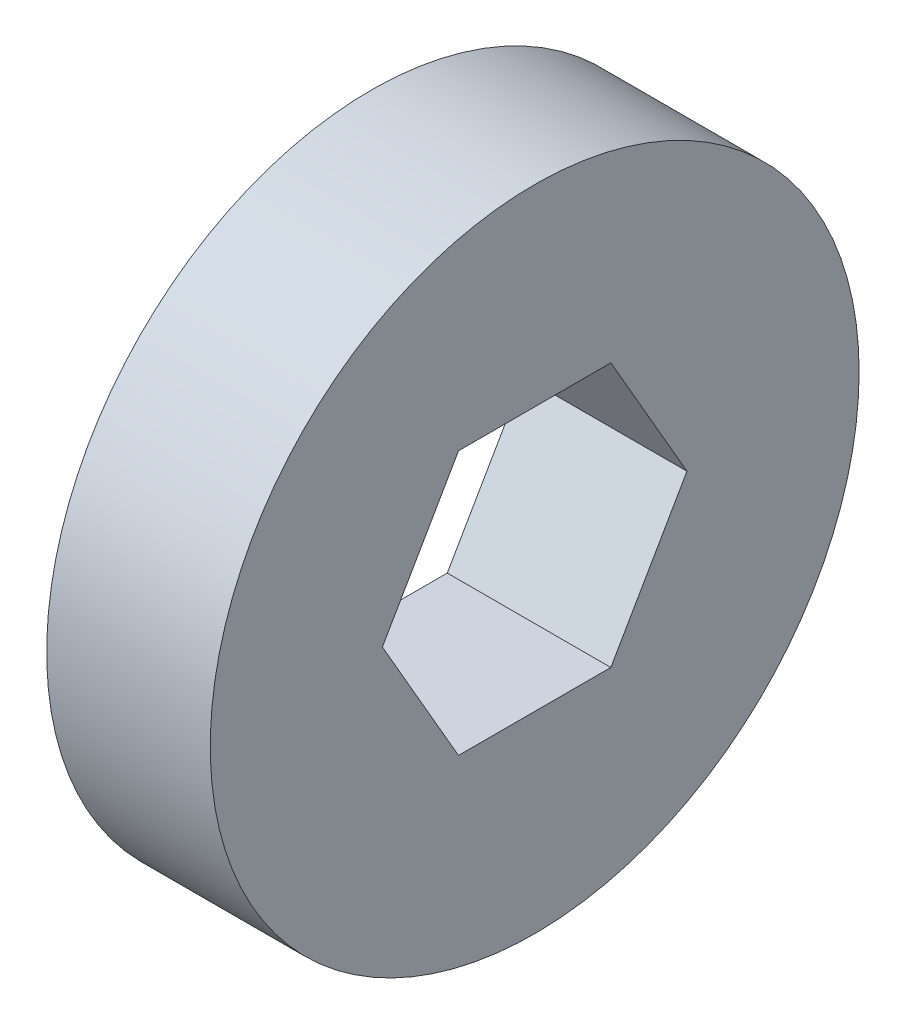
ISO-10303-21;
HEADER;
FILE_DESCRIPTION(('STEP AP214'),'2;1');
FILE_NAME('part.step','',(''),(''),'','','');
FILE_SCHEMA(('AUTOMOTIVE_DESIGN { 1 0 10303 214 1 1 1 1 }'));
ENDSEC;
DATA;
#1=APPLICATION_CONTEXT('core data for automotive mechanical design processes');
#2=APPLICATION_PROTOCOL_DEFINITION('international standard','automotive_design',2000,#1);
#3=PRODUCT_CONTEXT('',#1,'mechanical');
#4=PRODUCT('Part','Part','',(#3));
#5=PRODUCT_RELATED_PRODUCT_CATEGORY('part','',(#4));
#6=PRODUCT_DEFINITION_FORMATION('','',#4);
#7=PRODUCT_DEFINITION_CONTEXT('part definition',#1,'design');
#8=PRODUCT_DEFINITION('design','',#6,#7);
#9=PRODUCT_DEFINITION_SHAPE('','',#8);
#10=(LENGTH_UNIT() NAMED_UNIT(*) SI_UNIT(.MILLI.,.METRE.));
#11=(NAMED_UNIT(*) PLANE_ANGLE_UNIT() SI_UNIT($,.RADIAN.));
#12=(NAMED_UNIT(*) SI_UNIT($,.STERADIAN.) SOLID_ANGLE_UNIT());
#13=UNCERTAINTY_MEASURE_WITH_UNIT(LENGTH_MEASURE(1.E-05),#10,'distance_accuracy_value','');
#14=(GEOMETRIC_REPRESENTATION_CONTEXT(3) GLOBAL_UNCERTAINTY_ASSIGNED_CONTEXT((#13)) GLOBAL_UNIT_ASSIGNED_CONTEXT((#10,
#11,#12)) REPRESENTATION_CONTEXT('',''));
#15=CARTESIAN_POINT('',(0.,0.,0.));
#16=DIRECTION('',(0.,0.,1.));
#17=DIRECTION('',(1.,0.,0.));
#18=AXIS2_PLACEMENT_3D('',#15,#16,#17);
#19=CARTESIAN_POINT('',(7.874,0.,0.));
#20=DIRECTION('',(1.,0.,0.));
#21=DIRECTION('',(0.,0.,-1.));
#22=AXIS2_PLACEMENT_3D('',#19,#20,#21);
#23=PLANE('',#22);
#24=CARTESIAN_POINT('',(7.874,0.,0.));
#25=DIRECTION('',(1.,0.,0.));
#26=DIRECTION('',(0.,0.,-1.));
#27=AXIS2_PLACEMENT_3D('',#24,#25,#26);
#28=CIRCLE('',#27,15.621);
#29=CARTESIAN_POINT('',(7.874,0.,-15.621));
#30=VERTEX_POINT('',#29);
#31=EDGE_CURVE('E11',#30,#30,#28,.T.);
#32=ORIENTED_EDGE('',*,*,#31,.T.);
#33=EDGE_LOOP('',(#32));
#34=FACE_BOUND('',#33,.T.);
#35=DIRECTION('',(0.,0.,1.));
#36=VECTOR('',#35,1.);
#37=CARTESIAN_POINT('',(7.874,6.35,-3.66617420935412));
#38=LINE('',#37,#36);
#39=CARTESIAN_POINT('',(7.874,6.35,-3.66617420935412));
#40=VERTEX_POINT('',#39);
#41=CARTESIAN_POINT('',(7.874,6.35,3.66617420935412));
#42=VERTEX_POINT('',#41);
#43=EDGE_CURVE('E94',#40,#42,#38,.T.);
#44=ORIENTED_EDGE('',*,*,#43,.F.);
#45=DIRECTION('',(0.,0.866025403784439,0.5));
#46=VECTOR('',#45,1.);
#47=CARTESIAN_POINT('',(7.874,0.,-7.33234841870825));
#48=LINE('',#47,#46);
#49=CARTESIAN_POINT('',(7.874,0.,-7.33234841870825));
#50=VERTEX_POINT('',#49);
#51=EDGE_CURVE('E86',#50,#40,#48,.T.);
#52=ORIENTED_EDGE('',*,*,#51,.F.);
#53=DIRECTION('',(0.,0.866025403784439,-0.5));
#54=VECTOR('',#53,1.);
#55=CARTESIAN_POINT('',(7.874,-6.35,-3.66617420935412));
#56=LINE('',#55,#54);
#57=CARTESIAN_POINT('',(7.874,-6.35,-3.66617420935412));
#58=VERTEX_POINT('',#57);
#59=EDGE_CURVE('E114',#58,#50,#56,.T.);
#60=ORIENTED_EDGE('',*,*,#59,.F.);
#61=DIRECTION('',(0.,0.,-1.));
#62=VECTOR('',#61,1.);
#63=CARTESIAN_POINT('',(7.874,-6.35,3.66617420935412));
#64=LINE('',#63,#62);
#65=CARTESIAN_POINT('',(7.874,-6.35,3.66617420935412));
#66=VERTEX_POINT('',#65);
#67=EDGE_CURVE('E112',#66,#58,#64,.T.);
#68=ORIENTED_EDGE('',*,*,#67,.F.);
#69=DIRECTION('',(0.,-0.866025403784438,-0.5));
#70=VECTOR('',#69,1.);
#71=CARTESIAN_POINT('',(7.874,0.,7.33234841870825));
#72=LINE('',#71,#70);
#73=CARTESIAN_POINT('',(7.874,0.,7.33234841870825));
#74=VERTEX_POINT('',#73);
#75=EDGE_CURVE('E108',#74,#66,#72,.T.);
#76=ORIENTED_EDGE('',*,*,#75,.F.);
#77=DIRECTION('',(0.,-0.866025403784439,0.5));
#78=VECTOR('',#77,1.);
#79=CARTESIAN_POINT('',(7.874,6.35,3.66617420935412));
#80=LINE('',#79,#78);
#81=EDGE_CURVE('E106',#42,#74,#80,.T.);
#82=ORIENTED_EDGE('',*,*,#81,.F.);
#83=EDGE_LOOP('',(#44,#52,#60,#68,#76,#82));
#84=FACE_BOUND('',#83,.T.);
#85=ADVANCED_FACE('F33',(#34,#84),#23,.T.);
#86=CARTESIAN_POINT('',(0.,0.,0.));
#87=DIRECTION('',(1.,0.,0.));
#88=DIRECTION('',(0.,0.,-1.));
#89=AXIS2_PLACEMENT_3D('',#86,#87,#88);
#90=PLANE('',#89);
#91=CARTESIAN_POINT('',(0.,0.,0.));
#92=DIRECTION('',(1.,0.,0.));
#93=DIRECTION('',(0.,0.,-1.));
#94=AXIS2_PLACEMENT_3D('',#91,#92,#93);
#95=CIRCLE('',#94,15.621);
#96=CARTESIAN_POINT('',(0.,0.,-15.621));
#97=VERTEX_POINT('',#96);
#98=EDGE_CURVE('E37',#97,#97,#95,.T.);
#99=ORIENTED_EDGE('',*,*,#98,.F.);
#100=EDGE_LOOP('',(#99));
#101=FACE_BOUND('',#100,.T.);
#102=DIRECTION('',(0.,0.866025403784439,0.5));
#103=VECTOR('',#102,1.);
#104=CARTESIAN_POINT('',(0.,0.,-7.33234841870825));
#105=LINE('',#104,#103);
#106=CARTESIAN_POINT('',(0.,0.,-7.33234841870825));
#107=VERTEX_POINT('',#106);
#108=CARTESIAN_POINT('',(0.,6.35,-3.66617420935412));
#109=VERTEX_POINT('',#108);
#110=EDGE_CURVE('E56',#107,#109,#105,.T.);
#111=ORIENTED_EDGE('',*,*,#110,.T.);
#112=DIRECTION('',(0.,0.,1.));
#113=VECTOR('',#112,1.);
#114=CARTESIAN_POINT('',(0.,6.35,-3.66617420935412));
#115=LINE('',#114,#113);
#116=CARTESIAN_POINT('',(0.,6.35,3.66617420935412));
#117=VERTEX_POINT('',#116);
#118=EDGE_CURVE('E101',#109,#117,#115,.T.);
#119=ORIENTED_EDGE('',*,*,#118,.T.);
#120=DIRECTION('',(0.,-0.866025403784439,0.5));
#121=VECTOR('',#120,1.);
#122=CARTESIAN_POINT('',(0.,6.35,3.66617420935412));
#123=LINE('',#122,#121);
#124=CARTESIAN_POINT('',(0.,0.,7.33234841870825));
#125=VERTEX_POINT('',#124);
#126=EDGE_CURVE('E118',#117,#125,#123,.T.);
#127=ORIENTED_EDGE('',*,*,#126,.T.);
#128=DIRECTION('',(0.,-0.866025403784438,-0.5));
#129=VECTOR('',#128,1.);
#130=CARTESIAN_POINT('',(0.,0.,7.33234841870825));
#131=LINE('',#130,#129);
#132=CARTESIAN_POINT('',(0.,-6.35,3.66617420935412));
#133=VERTEX_POINT('',#132);
#134=EDGE_CURVE('E121',#125,#133,#131,.T.);
#135=ORIENTED_EDGE('',*,*,#134,.T.);
#136=DIRECTION('',(0.,0.,-1.));
#137=VECTOR('',#136,1.);
#138=CARTESIAN_POINT('',(0.,-6.35,3.66617420935412));
#139=LINE('',#138,#137);
#140=CARTESIAN_POINT('',(0.,-6.35,-3.66617420935412));
#141=VERTEX_POINT('',#140);
#142=EDGE_CURVE('E124',#133,#141,#139,.T.);
#143=ORIENTED_EDGE('',*,*,#142,.T.);
#144=DIRECTION('',(0.,0.866025403784439,-0.5));
#145=VECTOR('',#144,1.);
#146=CARTESIAN_POINT('',(0.,-6.35,-3.66617420935412));
#147=LINE('',#146,#145);
#148=EDGE_CURVE('E95',#141,#107,#147,.T.);
#149=ORIENTED_EDGE('',*,*,#148,.T.);
#150=EDGE_LOOP('',(#111,#119,#127,#135,#143,#149));
#151=FACE_BOUND('',#150,.T.);
#152=ADVANCED_FACE('F141',(#101,#151),#90,.F.);
#153=CARTESIAN_POINT('',(7.874,0.,0.));
#154=DIRECTION('',(-1.,0.,0.));
#155=DIRECTION('',(0.,0.,1.));
#156=AXIS2_PLACEMENT_3D('',#153,#154,#155);
#157=CYLINDRICAL_SURFACE('',#156,15.621);
#158=ORIENTED_EDGE('',*,*,#31,.F.);
#159=EDGE_LOOP('',(#158));
#160=FACE_BOUND('',#159,.T.);
#161=ORIENTED_EDGE('',*,*,#98,.T.);
#162=EDGE_LOOP('',(#161));
#163=FACE_BOUND('',#162,.T.);
#164=ADVANCED_FACE('F35',(#160,#163),#157,.T.);
#165=CARTESIAN_POINT('',(7.874,0.,-7.33234841870825));
#166=DIRECTION('',(0.,-0.5,0.866025403784439));
#167=DIRECTION('',(0.,-0.866025403784439,-0.5));
#168=AXIS2_PLACEMENT_3D('',#165,#166,#167);
#169=PLANE('',#168);
#170=ORIENTED_EDGE('',*,*,#110,.F.);
#171=DIRECTION('',(-1.,0.,0.));
#172=VECTOR('',#171,1.);
#173=CARTESIAN_POINT('',(7.874,0.,-7.33234841870825));
#174=LINE('',#173,#172);
#175=EDGE_CURVE('E90',#50,#107,#174,.T.);
#176=ORIENTED_EDGE('',*,*,#175,.F.);
#177=ORIENTED_EDGE('',*,*,#51,.T.);
#178=DIRECTION('',(-1.,0.,0.));
#179=VECTOR('',#178,1.);
#180=CARTESIAN_POINT('',(7.874,6.35,-3.66617420935412));
#181=LINE('',#180,#179);
#182=EDGE_CURVE('E89',#40,#109,#181,.T.);
#183=ORIENTED_EDGE('',*,*,#182,.T.);
#184=EDGE_LOOP('',(#170,#176,#177,#183));
#185=FACE_BOUND('',#184,.T.);
#186=ADVANCED_FACE('F88',(#185),#169,.T.);
#187=CARTESIAN_POINT('',(7.874,6.35,-3.66617420935412));
#188=DIRECTION('',(0.,-1.,0.));
#189=DIRECTION('',(0.,0.,-1.));
#190=AXIS2_PLACEMENT_3D('',#187,#188,#189);
#191=PLANE('',#190);
#192=ORIENTED_EDGE('',*,*,#118,.F.);
#193=ORIENTED_EDGE('',*,*,#182,.F.);
#194=ORIENTED_EDGE('',*,*,#43,.T.);
#195=DIRECTION('',(-1.,0.,0.));
#196=VECTOR('',#195,1.);
#197=CARTESIAN_POINT('',(7.874,6.35,3.66617420935412));
#198=LINE('',#197,#196);
#199=EDGE_CURVE('E102',#42,#117,#198,.T.);
#200=ORIENTED_EDGE('',*,*,#199,.T.);
#201=EDGE_LOOP('',(#192,#193,#194,#200));
#202=FACE_BOUND('',#201,.T.);
#203=ADVANCED_FACE('F98',(#202),#191,.T.);
#204=CARTESIAN_POINT('',(7.874,6.35,3.66617420935412));
#205=DIRECTION('',(0.,-0.5,-0.866025403784439));
#206=DIRECTION('',(0.,0.866025403784439,-0.5));
#207=AXIS2_PLACEMENT_3D('',#204,#205,#206);
#208=PLANE('',#207);
#209=ORIENTED_EDGE('',*,*,#126,.F.);
#210=ORIENTED_EDGE('',*,*,#199,.F.);
#211=ORIENTED_EDGE('',*,*,#81,.T.);
#212=DIRECTION('',(-1.,0.,0.));
#213=VECTOR('',#212,1.);
#214=CARTESIAN_POINT('',(7.874,0.,7.33234841870825));
#215=LINE('',#214,#213);
#216=EDGE_CURVE('E133',#74,#125,#215,.T.);
#217=ORIENTED_EDGE('',*,*,#216,.T.);
#218=EDGE_LOOP('',(#209,#210,#211,#217));
#219=FACE_BOUND('',#218,.T.);
#220=ADVANCED_FACE('F137',(#219),#208,.T.);
#221=CARTESIAN_POINT('',(7.874,0.,7.33234841870825));
#222=DIRECTION('',(0.,0.5,-0.866025403784439));
#223=DIRECTION('',(0.,0.866025403784439,0.5));
#224=AXIS2_PLACEMENT_3D('',#221,#222,#223);
#225=PLANE('',#224);
#226=ORIENTED_EDGE('',*,*,#134,.F.);
#227=ORIENTED_EDGE('',*,*,#216,.F.);
#228=ORIENTED_EDGE('',*,*,#75,.T.);
#229=DIRECTION('',(-1.,0.,0.));
#230=VECTOR('',#229,1.);
#231=CARTESIAN_POINT('',(7.874,-6.35,3.66617420935412));
#232=LINE('',#231,#230);
#233=EDGE_CURVE('E131',#66,#133,#232,.T.);
#234=ORIENTED_EDGE('',*,*,#233,.T.);
#235=EDGE_LOOP('',(#226,#227,#228,#234));
#236=FACE_BOUND('',#235,.T.);
#237=ADVANCED_FACE('F149',(#236),#225,.T.);
#238=CARTESIAN_POINT('',(7.874,-6.35,3.66617420935412));
#239=DIRECTION('',(0.,1.,0.));
#240=DIRECTION('',(0.,0.,1.));
#241=AXIS2_PLACEMENT_3D('',#238,#239,#240);
#242=PLANE('',#241);
#243=ORIENTED_EDGE('',*,*,#142,.F.);
#244=ORIENTED_EDGE('',*,*,#233,.F.);
#245=ORIENTED_EDGE('',*,*,#67,.T.);
#246=DIRECTION('',(-1.,0.,0.));
#247=VECTOR('',#246,1.);
#248=CARTESIAN_POINT('',(7.874,-6.35,-3.66617420935412));
#249=LINE('',#248,#247);
#250=EDGE_CURVE('E48',#58,#141,#249,.T.);
#251=ORIENTED_EDGE('',*,*,#250,.T.);
#252=EDGE_LOOP('',(#243,#244,#245,#251));
#253=FACE_BOUND('',#252,.T.);
#254=ADVANCED_FACE('F147',(#253),#242,.T.);
#255=CARTESIAN_POINT('',(7.874,-6.35,-3.66617420935412));
#256=DIRECTION('',(0.,0.5,0.866025403784439));
#257=DIRECTION('',(0.,-0.866025403784439,0.5));
#258=AXIS2_PLACEMENT_3D('',#255,#256,#257);
#259=PLANE('',#258);
#260=ORIENTED_EDGE('',*,*,#148,.F.);
#261=ORIENTED_EDGE('',*,*,#250,.F.);
#262=ORIENTED_EDGE('',*,*,#59,.T.);
#263=ORIENTED_EDGE('',*,*,#175,.T.);
#264=EDGE_LOOP('',(#260,#261,#262,#263));
#265=FACE_BOUND('',#264,.T.);
#266=ADVANCED_FACE('F143',(#265),#259,.T.);
#267=CLOSED_SHELL('',(#85,#152,#164,#186,#203,#220,#237,#254,#266));
#268=MANIFOLD_SOLID_BREP('B2',#267);
#269=ADVANCED_BREP_SHAPE_REPRESENTATION('',(#18,#268),#14);
#270=SHAPE_DEFINITION_REPRESENTATION(#9,#269);
ENDSEC;
END-ISO-10303-21;
